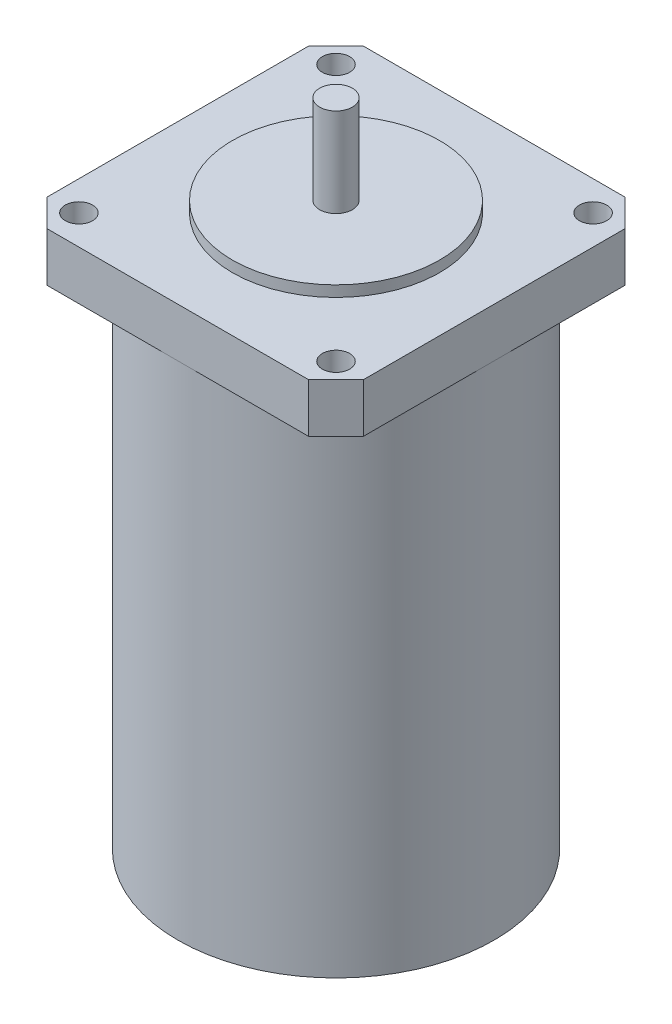
ISO-10303-21;
HEADER;
FILE_DESCRIPTION(('STEP AP214'),'2;1');
FILE_NAME('part.step','',(''),(''),'','','');
FILE_SCHEMA(('AUTOMOTIVE_DESIGN { 1 0 10303 214 1 1 1 1 }'));
ENDSEC;
DATA;
#1=APPLICATION_CONTEXT('core data for automotive mechanical design processes');
#2=APPLICATION_PROTOCOL_DEFINITION('international standard','automotive_design',2000,#1);
#3=PRODUCT_CONTEXT('',#1,'mechanical');
#4=PRODUCT('Part','Part','',(#3));
#5=PRODUCT_RELATED_PRODUCT_CATEGORY('part','',(#4));
#6=PRODUCT_DEFINITION_FORMATION('','',#4);
#7=PRODUCT_DEFINITION_CONTEXT('part definition',#1,'design');
#8=PRODUCT_DEFINITION('design','',#6,#7);
#9=PRODUCT_DEFINITION_SHAPE('','',#8);
#10=(LENGTH_UNIT() NAMED_UNIT(*) SI_UNIT(.MILLI.,.METRE.));
#11=(NAMED_UNIT(*) PLANE_ANGLE_UNIT() SI_UNIT($,.RADIAN.));
#12=(NAMED_UNIT(*) SI_UNIT($,.STERADIAN.) SOLID_ANGLE_UNIT());
#13=UNCERTAINTY_MEASURE_WITH_UNIT(LENGTH_MEASURE(1.E-05),#10,'distance_accuracy_value','');
#14=(GEOMETRIC_REPRESENTATION_CONTEXT(3) GLOBAL_UNCERTAINTY_ASSIGNED_CONTEXT((#13)) GLOBAL_UNIT_ASSIGNED_CONTEXT((#10,
#11,#12)) REPRESENTATION_CONTEXT('',''));
#15=CARTESIAN_POINT('',(0.,0.,0.));
#16=DIRECTION('',(0.,0.,1.));
#17=DIRECTION('',(1.,0.,0.));
#18=AXIS2_PLACEMENT_3D('',#15,#16,#17);
#19=CARTESIAN_POINT('',(0.,101.,0.));
#20=DIRECTION('',(0.,-1.,0.));
#21=DIRECTION('',(0.,0.,-1.));
#22=AXIS2_PLACEMENT_3D('',#19,#20,#21);
#23=CYLINDRICAL_SURFACE('',#22,29.);
#24=CARTESIAN_POINT('',(0.,92.,0.));
#25=DIRECTION('',(0.,-1.,0.));
#26=DIRECTION('',(0.,0.,-1.));
#27=AXIS2_PLACEMENT_3D('',#24,#25,#26);
#28=CIRCLE('',#27,29.);
#29=CARTESIAN_POINT('',(-29.,92.,0.));
#30=VERTEX_POINT('',#29);
#31=CARTESIAN_POINT('',(0.,92.,-29.));
#32=VERTEX_POINT('',#31);
#33=EDGE_CURVE('E48',#30,#32,#28,.T.);
#34=ORIENTED_EDGE('',*,*,#33,.T.);
#35=CARTESIAN_POINT('',(29.,92.,0.));
#36=VERTEX_POINT('',#35);
#37=EDGE_CURVE('E54',#32,#36,#28,.T.);
#38=ORIENTED_EDGE('',*,*,#37,.T.);
#39=CARTESIAN_POINT('',(0.,92.,29.));
#40=VERTEX_POINT('',#39);
#41=EDGE_CURVE('E240',#36,#40,#28,.T.);
#42=ORIENTED_EDGE('',*,*,#41,.T.);
#43=EDGE_CURVE('E236',#40,#30,#28,.T.);
#44=ORIENTED_EDGE('',*,*,#43,.T.);
#45=EDGE_LOOP('',(#34,#38,#42,#44));
#46=FACE_BOUND('',#45,.T.);
#47=CARTESIAN_POINT('',(0.,0.,0.));
#48=DIRECTION('',(0.,1.,0.));
#49=DIRECTION('',(0.,0.,1.));
#50=AXIS2_PLACEMENT_3D('',#47,#48,#49);
#51=CIRCLE('',#50,29.);
#52=CARTESIAN_POINT('',(0.,0.,29.));
#53=VERTEX_POINT('',#52);
#54=EDGE_CURVE('E210',#53,#53,#51,.T.);
#55=ORIENTED_EDGE('',*,*,#54,.T.);
#56=EDGE_LOOP('',(#55));
#57=FACE_BOUND('',#56,.T.);
#58=ADVANCED_FACE('F45',(#46,#57),#23,.T.);
#59=CARTESIAN_POINT('',(0.,0.,0.));
#60=DIRECTION('',(0.,1.,0.));
#61=DIRECTION('',(0.,0.,1.));
#62=AXIS2_PLACEMENT_3D('',#59,#60,#61);
#63=PLANE('',#62);
#64=ORIENTED_EDGE('',*,*,#54,.F.);
#65=EDGE_LOOP('',(#64));
#66=FACE_BOUND('',#65,.T.);
#67=ADVANCED_FACE('F284',(#66),#63,.F.);
#68=CARTESIAN_POINT('',(0.,92.,0.));
#69=DIRECTION('',(0.,-1.,0.));
#70=DIRECTION('',(0.,0.,-1.));
#71=AXIS2_PLACEMENT_3D('',#68,#69,#70);
#72=PLANE('',#71);
#73=ORIENTED_EDGE('',*,*,#37,.F.);
#74=DIRECTION('',(-1.,0.,0.));
#75=VECTOR('',#74,1.);
#76=CARTESIAN_POINT('',(-24.,92.,-29.));
#77=LINE('',#76,#75);
#78=CARTESIAN_POINT('',(24.,92.,-29.));
#79=VERTEX_POINT('',#78);
#80=EDGE_CURVE('E62',#79,#32,#77,.T.);
#81=ORIENTED_EDGE('',*,*,#80,.F.);
#82=DIRECTION('',(-0.707106781186548,0.,-0.707106781186548));
#83=VECTOR('',#82,1.);
#84=CARTESIAN_POINT('',(24.,92.,-29.));
#85=LINE('',#84,#83);
#86=CARTESIAN_POINT('',(29.,92.,-24.));
#87=VERTEX_POINT('',#86);
#88=EDGE_CURVE('E170',#87,#79,#85,.T.);
#89=ORIENTED_EDGE('',*,*,#88,.F.);
#90=DIRECTION('',(0.,0.,-1.));
#91=VECTOR('',#90,1.);
#92=CARTESIAN_POINT('',(29.,92.,24.));
#93=LINE('',#92,#91);
#94=EDGE_CURVE('E165',#36,#87,#93,.T.);
#95=ORIENTED_EDGE('',*,*,#94,.F.);
#96=EDGE_LOOP('',(#73,#81,#89,#95));
#97=FACE_BOUND('',#96,.T.);
#98=CARTESIAN_POINT('',(23.57,92.,-23.57));
#99=DIRECTION('',(0.,1.,0.));
#100=DIRECTION('',(0.,0.,1.));
#101=AXIS2_PLACEMENT_3D('',#98,#99,#100);
#102=CIRCLE('',#101,2.50000000000001);
#103=CARTESIAN_POINT('',(23.57,92.,-21.07));
#104=VERTEX_POINT('',#103);
#105=EDGE_CURVE('E376',#104,#104,#102,.T.);
#106=ORIENTED_EDGE('',*,*,#105,.T.);
#107=EDGE_LOOP('',(#106));
#108=FACE_BOUND('',#107,.T.);
#109=ADVANCED_FACE('F254',(#97,#108),#72,.T.);
#110=ORIENTED_EDGE('',*,*,#41,.F.);
#111=CARTESIAN_POINT('',(29.,92.,24.));
#112=VERTEX_POINT('',#111);
#113=EDGE_CURVE('E166',#112,#36,#93,.T.);
#114=ORIENTED_EDGE('',*,*,#113,.F.);
#115=DIRECTION('',(0.707106781186548,0.,-0.707106781186547));
#116=VECTOR('',#115,1.);
#117=CARTESIAN_POINT('',(24.,92.,29.));
#118=LINE('',#117,#116);
#119=CARTESIAN_POINT('',(24.,92.,29.));
#120=VERTEX_POINT('',#119);
#121=EDGE_CURVE('E161',#120,#112,#118,.T.);
#122=ORIENTED_EDGE('',*,*,#121,.F.);
#123=DIRECTION('',(1.,0.,0.));
#124=VECTOR('',#123,1.);
#125=CARTESIAN_POINT('',(-24.,92.,29.));
#126=LINE('',#125,#124);
#127=EDGE_CURVE('E153',#40,#120,#126,.T.);
#128=ORIENTED_EDGE('',*,*,#127,.F.);
#129=EDGE_LOOP('',(#110,#114,#122,#128));
#130=FACE_BOUND('',#129,.T.);
#131=CARTESIAN_POINT('',(23.57,92.,23.57));
#132=DIRECTION('',(0.,1.,0.));
#133=DIRECTION('',(0.,0.,1.));
#134=AXIS2_PLACEMENT_3D('',#131,#132,#133);
#135=CIRCLE('',#134,2.50000000000001);
#136=CARTESIAN_POINT('',(23.57,92.,26.07));
#137=VERTEX_POINT('',#136);
#138=EDGE_CURVE('E368',#137,#137,#135,.T.);
#139=ORIENTED_EDGE('',*,*,#138,.T.);
#140=EDGE_LOOP('',(#139));
#141=FACE_BOUND('',#140,.T.);
#142=ADVANCED_FACE('F249',(#130,#141),#72,.T.);
#143=ORIENTED_EDGE('',*,*,#43,.F.);
#144=CARTESIAN_POINT('',(-24.,92.,29.));
#145=VERTEX_POINT('',#144);
#146=EDGE_CURVE('E151',#145,#40,#126,.T.);
#147=ORIENTED_EDGE('',*,*,#146,.F.);
#148=DIRECTION('',(0.707106781186547,0.,0.707106781186548));
#149=VECTOR('',#148,1.);
#150=CARTESIAN_POINT('',(-24.,92.,29.));
#151=LINE('',#150,#149);
#152=CARTESIAN_POINT('',(-29.,92.,24.));
#153=VERTEX_POINT('',#152);
#154=EDGE_CURVE('E140',#153,#145,#151,.T.);
#155=ORIENTED_EDGE('',*,*,#154,.F.);
#156=DIRECTION('',(0.,0.,1.));
#157=VECTOR('',#156,1.);
#158=CARTESIAN_POINT('',(-29.,92.,24.));
#159=LINE('',#158,#157);
#160=EDGE_CURVE('E124',#30,#153,#159,.T.);
#161=ORIENTED_EDGE('',*,*,#160,.F.);
#162=EDGE_LOOP('',(#143,#147,#155,#161));
#163=FACE_BOUND('',#162,.T.);
#164=CARTESIAN_POINT('',(-23.57,92.,23.57));
#165=DIRECTION('',(0.,1.,0.));
#166=DIRECTION('',(0.,0.,1.));
#167=AXIS2_PLACEMENT_3D('',#164,#165,#166);
#168=CIRCLE('',#167,2.5);
#169=CARTESIAN_POINT('',(-23.57,92.,26.07));
#170=VERTEX_POINT('',#169);
#171=EDGE_CURVE('E360',#170,#170,#168,.T.);
#172=ORIENTED_EDGE('',*,*,#171,.T.);
#173=EDGE_LOOP('',(#172));
#174=FACE_BOUND('',#173,.T.);
#175=ADVANCED_FACE('F148',(#163,#174),#72,.T.);
#176=CARTESIAN_POINT('',(-29.,92.,24.));
#177=DIRECTION('',(-1.,0.,0.));
#178=DIRECTION('',(0.,0.,1.));
#179=AXIS2_PLACEMENT_3D('',#176,#177,#178);
#180=PLANE('',#179);
#181=CARTESIAN_POINT('',(-29.,92.,-24.));
#182=VERTEX_POINT('',#181);
#183=EDGE_CURVE('E129',#182,#30,#159,.T.);
#184=ORIENTED_EDGE('',*,*,#183,.T.);
#185=ORIENTED_EDGE('',*,*,#160,.T.);
#186=DIRECTION('',(0.,1.,0.));
#187=VECTOR('',#186,1.);
#188=CARTESIAN_POINT('',(-29.,92.,24.));
#189=LINE('',#188,#187);
#190=CARTESIAN_POINT('',(-29.,101.,24.));
#191=VERTEX_POINT('',#190);
#192=EDGE_CURVE('E127',#153,#191,#189,.T.);
#193=ORIENTED_EDGE('',*,*,#192,.T.);
#194=DIRECTION('',(0.,0.,1.));
#195=VECTOR('',#194,1.);
#196=CARTESIAN_POINT('',(-29.,101.,24.));
#197=LINE('',#196,#195);
#198=CARTESIAN_POINT('',(-29.,101.,-24.));
#199=VERTEX_POINT('',#198);
#200=EDGE_CURVE('E180',#199,#191,#197,.T.);
#201=ORIENTED_EDGE('',*,*,#200,.F.);
#202=DIRECTION('',(0.,1.,0.));
#203=VECTOR('',#202,1.);
#204=CARTESIAN_POINT('',(-29.,92.,-24.));
#205=LINE('',#204,#203);
#206=EDGE_CURVE('E206',#182,#199,#205,.T.);
#207=ORIENTED_EDGE('',*,*,#206,.F.);
#208=EDGE_LOOP('',(#184,#185,#193,#201,#207));
#209=FACE_BOUND('',#208,.T.);
#210=ADVANCED_FACE('F126',(#209),#180,.T.);
#211=CARTESIAN_POINT('',(-24.,92.,-29.));
#212=DIRECTION('',(0.,0.,-1.));
#213=DIRECTION('',(-1.,0.,0.));
#214=AXIS2_PLACEMENT_3D('',#211,#212,#213);
#215=PLANE('',#214);
#216=ORIENTED_EDGE('',*,*,#80,.T.);
#217=CARTESIAN_POINT('',(-24.,92.,-29.));
#218=VERTEX_POINT('',#217);
#219=EDGE_CURVE('E174',#32,#218,#77,.T.);
#220=ORIENTED_EDGE('',*,*,#219,.T.);
#221=DIRECTION('',(0.,1.,0.));
#222=VECTOR('',#221,1.);
#223=CARTESIAN_POINT('',(-24.,92.,-29.));
#224=LINE('',#223,#222);
#225=CARTESIAN_POINT('',(-24.,101.,-29.));
#226=VERTEX_POINT('',#225);
#227=EDGE_CURVE('E211',#218,#226,#224,.T.);
#228=ORIENTED_EDGE('',*,*,#227,.T.);
#229=DIRECTION('',(-1.,0.,0.));
#230=VECTOR('',#229,1.);
#231=CARTESIAN_POINT('',(-24.,101.,-29.));
#232=LINE('',#231,#230);
#233=CARTESIAN_POINT('',(24.,101.,-29.));
#234=VERTEX_POINT('',#233);
#235=EDGE_CURVE('E200',#234,#226,#232,.T.);
#236=ORIENTED_EDGE('',*,*,#235,.F.);
#237=DIRECTION('',(0.,1.,0.));
#238=VECTOR('',#237,1.);
#239=CARTESIAN_POINT('',(24.,92.,-29.));
#240=LINE('',#239,#238);
#241=EDGE_CURVE('E215',#79,#234,#240,.T.);
#242=ORIENTED_EDGE('',*,*,#241,.F.);
#243=EDGE_LOOP('',(#216,#220,#228,#236,#242));
#244=FACE_BOUND('',#243,.T.);
#245=ADVANCED_FACE('F279',(#244),#215,.T.);
#246=CARTESIAN_POINT('',(29.,92.,24.));
#247=DIRECTION('',(1.,0.,0.));
#248=DIRECTION('',(0.,0.,-1.));
#249=AXIS2_PLACEMENT_3D('',#246,#247,#248);
#250=PLANE('',#249);
#251=ORIENTED_EDGE('',*,*,#113,.T.);
#252=ORIENTED_EDGE('',*,*,#94,.T.);
#253=DIRECTION('',(0.,1.,0.));
#254=VECTOR('',#253,1.);
#255=CARTESIAN_POINT('',(29.,92.,-24.));
#256=LINE('',#255,#254);
#257=CARTESIAN_POINT('',(29.,101.,-24.));
#258=VERTEX_POINT('',#257);
#259=EDGE_CURVE('E218',#87,#258,#256,.T.);
#260=ORIENTED_EDGE('',*,*,#259,.T.);
#261=DIRECTION('',(0.,0.,-1.));
#262=VECTOR('',#261,1.);
#263=CARTESIAN_POINT('',(29.,101.,24.));
#264=LINE('',#263,#262);
#265=CARTESIAN_POINT('',(29.,101.,24.));
#266=VERTEX_POINT('',#265);
#267=EDGE_CURVE('E193',#266,#258,#264,.T.);
#268=ORIENTED_EDGE('',*,*,#267,.F.);
#269=DIRECTION('',(0.,1.,0.));
#270=VECTOR('',#269,1.);
#271=CARTESIAN_POINT('',(29.,92.,24.));
#272=LINE('',#271,#270);
#273=EDGE_CURVE('E222',#112,#266,#272,.T.);
#274=ORIENTED_EDGE('',*,*,#273,.F.);
#275=EDGE_LOOP('',(#251,#252,#260,#268,#274));
#276=FACE_BOUND('',#275,.T.);
#277=ADVANCED_FACE('F259',(#276),#250,.T.);
#278=CARTESIAN_POINT('',(-24.,92.,29.));
#279=DIRECTION('',(0.,0.,1.));
#280=DIRECTION('',(1.,0.,0.));
#281=AXIS2_PLACEMENT_3D('',#278,#279,#280);
#282=PLANE('',#281);
#283=ORIENTED_EDGE('',*,*,#146,.T.);
#284=ORIENTED_EDGE('',*,*,#127,.T.);
#285=DIRECTION('',(0.,1.,0.));
#286=VECTOR('',#285,1.);
#287=CARTESIAN_POINT('',(24.,92.,29.));
#288=LINE('',#287,#286);
#289=CARTESIAN_POINT('',(24.,101.,29.));
#290=VERTEX_POINT('',#289);
#291=EDGE_CURVE('E226',#120,#290,#288,.T.);
#292=ORIENTED_EDGE('',*,*,#291,.T.);
#293=DIRECTION('',(1.,0.,0.));
#294=VECTOR('',#293,1.);
#295=CARTESIAN_POINT('',(-24.,101.,29.));
#296=LINE('',#295,#294);
#297=CARTESIAN_POINT('',(-24.,101.,29.));
#298=VERTEX_POINT('',#297);
#299=EDGE_CURVE('E186',#298,#290,#296,.T.);
#300=ORIENTED_EDGE('',*,*,#299,.F.);
#301=DIRECTION('',(0.,1.,0.));
#302=VECTOR('',#301,1.);
#303=CARTESIAN_POINT('',(-24.,92.,29.));
#304=LINE('',#303,#302);
#305=EDGE_CURVE('E144',#145,#298,#304,.T.);
#306=ORIENTED_EDGE('',*,*,#305,.F.);
#307=EDGE_LOOP('',(#283,#284,#292,#300,#306));
#308=FACE_BOUND('',#307,.T.);
#309=ADVANCED_FACE('F268',(#308),#282,.T.);
#310=CARTESIAN_POINT('',(-29.,92.,-24.));
#311=DIRECTION('',(-0.707106781186547,0.,-0.707106781186547));
#312=DIRECTION('',(-0.707106781186548,0.,0.707106781186548));
#313=AXIS2_PLACEMENT_3D('',#310,#311,#312);
#314=PLANE('',#313);
#315=DIRECTION('',(-0.707106781186547,0.,0.707106781186547));
#316=VECTOR('',#315,1.);
#317=CARTESIAN_POINT('',(-29.,101.,-24.));
#318=LINE('',#317,#316);
#319=EDGE_CURVE('E134',#226,#199,#318,.T.);
#320=ORIENTED_EDGE('',*,*,#319,.F.);
#321=ORIENTED_EDGE('',*,*,#227,.F.);
#322=DIRECTION('',(-0.707106781186547,0.,0.707106781186547));
#323=VECTOR('',#322,1.);
#324=CARTESIAN_POINT('',(-29.,92.,-24.));
#325=LINE('',#324,#323);
#326=EDGE_CURVE('E145',#218,#182,#325,.T.);
#327=ORIENTED_EDGE('',*,*,#326,.T.);
#328=ORIENTED_EDGE('',*,*,#206,.T.);
#329=EDGE_LOOP('',(#320,#321,#327,#328));
#330=FACE_BOUND('',#329,.T.);
#331=ADVANCED_FACE('F270',(#330),#314,.T.);
#332=CARTESIAN_POINT('',(24.,92.,-29.));
#333=DIRECTION('',(0.707106781186547,0.,-0.707106781186547));
#334=DIRECTION('',(-0.707106781186548,0.,-0.707106781186548));
#335=AXIS2_PLACEMENT_3D('',#332,#333,#334);
#336=PLANE('',#335);
#337=DIRECTION('',(-0.707106781186548,0.,-0.707106781186548));
#338=VECTOR('',#337,1.);
#339=CARTESIAN_POINT('',(24.,101.,-29.));
#340=LINE('',#339,#338);
#341=EDGE_CURVE('E196',#258,#234,#340,.T.);
#342=ORIENTED_EDGE('',*,*,#341,.F.);
#343=ORIENTED_EDGE('',*,*,#259,.F.);
#344=ORIENTED_EDGE('',*,*,#88,.T.);
#345=ORIENTED_EDGE('',*,*,#241,.T.);
#346=EDGE_LOOP('',(#342,#343,#344,#345));
#347=FACE_BOUND('',#346,.T.);
#348=ADVANCED_FACE('F276',(#347),#336,.T.);
#349=CARTESIAN_POINT('',(24.,92.,29.));
#350=DIRECTION('',(0.707106781186547,0.,0.707106781186548));
#351=DIRECTION('',(0.707106781186548,0.,-0.707106781186547));
#352=AXIS2_PLACEMENT_3D('',#349,#350,#351);
#353=PLANE('',#352);
#354=DIRECTION('',(0.707106781186548,0.,-0.707106781186547));
#355=VECTOR('',#354,1.);
#356=CARTESIAN_POINT('',(24.,101.,29.));
#357=LINE('',#356,#355);
#358=EDGE_CURVE('E189',#290,#266,#357,.T.);
#359=ORIENTED_EDGE('',*,*,#358,.F.);
#360=ORIENTED_EDGE('',*,*,#291,.F.);
#361=ORIENTED_EDGE('',*,*,#121,.T.);
#362=ORIENTED_EDGE('',*,*,#273,.T.);
#363=EDGE_LOOP('',(#359,#360,#361,#362));
#364=FACE_BOUND('',#363,.T.);
#365=ADVANCED_FACE('F262',(#364),#353,.T.);
#366=CARTESIAN_POINT('',(-24.,92.,29.));
#367=DIRECTION('',(-0.707106781186548,0.,0.707106781186547));
#368=DIRECTION('',(0.707106781186547,0.,0.707106781186548));
#369=AXIS2_PLACEMENT_3D('',#366,#367,#368);
#370=PLANE('',#369);
#371=DIRECTION('',(0.707106781186547,0.,0.707106781186548));
#372=VECTOR('',#371,1.);
#373=CARTESIAN_POINT('',(-24.,101.,29.));
#374=LINE('',#373,#372);
#375=EDGE_CURVE('E142',#191,#298,#374,.T.);
#376=ORIENTED_EDGE('',*,*,#375,.F.);
#377=ORIENTED_EDGE('',*,*,#192,.F.);
#378=ORIENTED_EDGE('',*,*,#154,.T.);
#379=ORIENTED_EDGE('',*,*,#305,.T.);
#380=EDGE_LOOP('',(#376,#377,#378,#379));
#381=FACE_BOUND('',#380,.T.);
#382=ADVANCED_FACE('F138',(#381),#370,.T.);
#383=ORIENTED_EDGE('',*,*,#33,.F.);
#384=ORIENTED_EDGE('',*,*,#183,.F.);
#385=ORIENTED_EDGE('',*,*,#326,.F.);
#386=ORIENTED_EDGE('',*,*,#219,.F.);
#387=EDGE_LOOP('',(#383,#384,#385,#386));
#388=FACE_BOUND('',#387,.T.);
#389=CARTESIAN_POINT('',(-23.57,92.,-23.57));
#390=DIRECTION('',(0.,1.,0.));
#391=DIRECTION('',(0.,0.,1.));
#392=AXIS2_PLACEMENT_3D('',#389,#390,#391);
#393=CIRCLE('',#392,2.5);
#394=CARTESIAN_POINT('',(-23.57,92.,-21.07));
#395=VERTEX_POINT('',#394);
#396=EDGE_CURVE('E183',#395,#395,#393,.T.);
#397=ORIENTED_EDGE('',*,*,#396,.T.);
#398=EDGE_LOOP('',(#397));
#399=FACE_BOUND('',#398,.T.);
#400=ADVANCED_FACE('F293',(#388,#399),#72,.T.);
#401=CARTESIAN_POINT('',(-23.57,92.,-23.57));
#402=DIRECTION('',(0.,1.,0.));
#403=DIRECTION('',(0.,0.,1.));
#404=AXIS2_PLACEMENT_3D('',#401,#402,#403);
#405=CYLINDRICAL_SURFACE('',#404,2.5);
#406=ORIENTED_EDGE('',*,*,#396,.F.);
#407=EDGE_LOOP('',(#406));
#408=FACE_BOUND('',#407,.T.);
#409=CARTESIAN_POINT('',(-23.57,101.,-23.57));
#410=DIRECTION('',(0.,1.,0.));
#411=DIRECTION('',(0.,0.,1.));
#412=AXIS2_PLACEMENT_3D('',#409,#410,#411);
#413=CIRCLE('',#412,2.5);
#414=CARTESIAN_POINT('',(-23.57,101.,-21.07));
#415=VERTEX_POINT('',#414);
#416=EDGE_CURVE('E380',#415,#415,#413,.T.);
#417=ORIENTED_EDGE('',*,*,#416,.T.);
#418=EDGE_LOOP('',(#417));
#419=FACE_BOUND('',#418,.T.);
#420=ADVANCED_FACE('F306',(#408,#419),#405,.F.);
#421=CARTESIAN_POINT('',(23.57,92.,-23.57));
#422=DIRECTION('',(0.,1.,0.));
#423=DIRECTION('',(0.,0.,1.));
#424=AXIS2_PLACEMENT_3D('',#421,#422,#423);
#425=CYLINDRICAL_SURFACE('',#424,2.50000000000001);
#426=ORIENTED_EDGE('',*,*,#105,.F.);
#427=EDGE_LOOP('',(#426));
#428=FACE_BOUND('',#427,.T.);
#429=CARTESIAN_POINT('',(23.57,101.,-23.57));
#430=DIRECTION('',(0.,1.,0.));
#431=DIRECTION('',(0.,0.,1.));
#432=AXIS2_PLACEMENT_3D('',#429,#430,#431);
#433=CIRCLE('',#432,2.50000000000001);
#434=CARTESIAN_POINT('',(23.57,101.,-21.07));
#435=VERTEX_POINT('',#434);
#436=EDGE_CURVE('E372',#435,#435,#433,.T.);
#437=ORIENTED_EDGE('',*,*,#436,.T.);
#438=EDGE_LOOP('',(#437));
#439=FACE_BOUND('',#438,.T.);
#440=ADVANCED_FACE('F317',(#428,#439),#425,.F.);
#441=CARTESIAN_POINT('',(23.57,92.,23.57));
#442=DIRECTION('',(0.,1.,0.));
#443=DIRECTION('',(0.,0.,1.));
#444=AXIS2_PLACEMENT_3D('',#441,#442,#443);
#445=CYLINDRICAL_SURFACE('',#444,2.50000000000001);
#446=ORIENTED_EDGE('',*,*,#138,.F.);
#447=EDGE_LOOP('',(#446));
#448=FACE_BOUND('',#447,.T.);
#449=CARTESIAN_POINT('',(23.57,101.,23.57));
#450=DIRECTION('',(0.,1.,0.));
#451=DIRECTION('',(0.,0.,1.));
#452=AXIS2_PLACEMENT_3D('',#449,#450,#451);
#453=CIRCLE('',#452,2.50000000000001);
#454=CARTESIAN_POINT('',(23.57,101.,26.07));
#455=VERTEX_POINT('',#454);
#456=EDGE_CURVE('E364',#455,#455,#453,.T.);
#457=ORIENTED_EDGE('',*,*,#456,.T.);
#458=EDGE_LOOP('',(#457));
#459=FACE_BOUND('',#458,.T.);
#460=ADVANCED_FACE('F321',(#448,#459),#445,.F.);
#461=CARTESIAN_POINT('',(-23.57,92.,23.57));
#462=DIRECTION('',(0.,1.,0.));
#463=DIRECTION('',(0.,0.,1.));
#464=AXIS2_PLACEMENT_3D('',#461,#462,#463);
#465=CYLINDRICAL_SURFACE('',#464,2.5);
#466=ORIENTED_EDGE('',*,*,#171,.F.);
#467=EDGE_LOOP('',(#466));
#468=FACE_BOUND('',#467,.T.);
#469=CARTESIAN_POINT('',(-23.57,101.,23.57));
#470=DIRECTION('',(0.,1.,0.));
#471=DIRECTION('',(0.,0.,1.));
#472=AXIS2_PLACEMENT_3D('',#469,#470,#471);
#473=CIRCLE('',#472,2.5);
#474=CARTESIAN_POINT('',(-23.57,101.,26.07));
#475=VERTEX_POINT('',#474);
#476=EDGE_CURVE('E358',#475,#475,#473,.T.);
#477=ORIENTED_EDGE('',*,*,#476,.T.);
#478=EDGE_LOOP('',(#477));
#479=FACE_BOUND('',#478,.T.);
#480=ADVANCED_FACE('F298',(#468,#479),#465,.F.);
#481=CARTESIAN_POINT('',(0.,101.,0.));
#482=DIRECTION('',(0.,1.,0.));
#483=DIRECTION('',(0.,0.,1.));
#484=AXIS2_PLACEMENT_3D('',#481,#482,#483);
#485=PLANE('',#484);
#486=CARTESIAN_POINT('',(0.,101.,0.));
#487=DIRECTION('',(0.,1.,0.));
#488=DIRECTION('',(0.,0.,1.));
#489=AXIS2_PLACEMENT_3D('',#486,#487,#488);
#490=CIRCLE('',#489,19.);
#491=CARTESIAN_POINT('',(0.,101.,19.));
#492=VERTEX_POINT('',#491);
#493=EDGE_CURVE('E349',#492,#492,#490,.T.);
#494=ORIENTED_EDGE('',*,*,#493,.F.);
#495=EDGE_LOOP('',(#494));
#496=FACE_BOUND('',#495,.T.);
#497=ORIENTED_EDGE('',*,*,#375,.T.);
#498=ORIENTED_EDGE('',*,*,#299,.T.);
#499=ORIENTED_EDGE('',*,*,#358,.T.);
#500=ORIENTED_EDGE('',*,*,#267,.T.);
#501=ORIENTED_EDGE('',*,*,#341,.T.);
#502=ORIENTED_EDGE('',*,*,#235,.T.);
#503=ORIENTED_EDGE('',*,*,#319,.T.);
#504=ORIENTED_EDGE('',*,*,#200,.T.);
#505=EDGE_LOOP('',(#497,#498,#499,#500,#501,#502,#503,#504));
#506=FACE_BOUND('',#505,.T.);
#507=ORIENTED_EDGE('',*,*,#416,.F.);
#508=EDGE_LOOP('',(#507));
#509=FACE_BOUND('',#508,.T.);
#510=ORIENTED_EDGE('',*,*,#476,.F.);
#511=EDGE_LOOP('',(#510));
#512=FACE_BOUND('',#511,.T.);
#513=ORIENTED_EDGE('',*,*,#456,.F.);
#514=EDGE_LOOP('',(#513));
#515=FACE_BOUND('',#514,.T.);
#516=ORIENTED_EDGE('',*,*,#436,.F.);
#517=EDGE_LOOP('',(#516));
#518=FACE_BOUND('',#517,.T.);
#519=ADVANCED_FACE('F265',(#496,#506,#509,#512,#515,#518),#485,.T.);
#520=CARTESIAN_POINT('',(0.,103.,0.));
#521=DIRECTION('',(0.,-1.,0.));
#522=DIRECTION('',(0.,0.,-1.));
#523=AXIS2_PLACEMENT_3D('',#520,#521,#522);
#524=CYLINDRICAL_SURFACE('',#523,19.);
#525=CARTESIAN_POINT('',(0.,103.,0.));
#526=DIRECTION('',(0.,1.,0.));
#527=DIRECTION('',(0.,0.,1.));
#528=AXIS2_PLACEMENT_3D('',#525,#526,#527);
#529=CIRCLE('',#528,19.);
#530=CARTESIAN_POINT('',(0.,103.,19.));
#531=VERTEX_POINT('',#530);
#532=EDGE_CURVE('E353',#531,#531,#529,.T.);
#533=ORIENTED_EDGE('',*,*,#532,.F.);
#534=EDGE_LOOP('',(#533));
#535=FACE_BOUND('',#534,.T.);
#536=ORIENTED_EDGE('',*,*,#493,.T.);
#537=EDGE_LOOP('',(#536));
#538=FACE_BOUND('',#537,.T.);
#539=ADVANCED_FACE('F297',(#535,#538),#524,.T.);
#540=CARTESIAN_POINT('',(0.,103.,0.));
#541=DIRECTION('',(0.,1.,0.));
#542=DIRECTION('',(0.,0.,1.));
#543=AXIS2_PLACEMENT_3D('',#540,#541,#542);
#544=PLANE('',#543);
#545=CARTESIAN_POINT('',(0.,103.,0.));
#546=DIRECTION('',(0.,1.,0.));
#547=DIRECTION('',(0.,0.,1.));
#548=AXIS2_PLACEMENT_3D('',#545,#546,#547);
#549=CIRCLE('',#548,3.);
#550=CARTESIAN_POINT('',(0.,103.,3.));
#551=VERTEX_POINT('',#550);
#552=EDGE_CURVE('E11',#551,#551,#549,.T.);
#553=ORIENTED_EDGE('',*,*,#552,.F.);
#554=EDGE_LOOP('',(#553));
#555=FACE_BOUND('',#554,.T.);
#556=ORIENTED_EDGE('',*,*,#532,.T.);
#557=EDGE_LOOP('',(#556));
#558=FACE_BOUND('',#557,.T.);
#559=ADVANCED_FACE('F331',(#555,#558),#544,.T.);
#560=CARTESIAN_POINT('',(0.,119.3,0.));
#561=DIRECTION('',(0.,-1.,0.));
#562=DIRECTION('',(0.,0.,-1.));
#563=AXIS2_PLACEMENT_3D('',#560,#561,#562);
#564=CYLINDRICAL_SURFACE('',#563,3.);
#565=CARTESIAN_POINT('',(0.,119.3,0.));
#566=DIRECTION('',(0.,1.,0.));
#567=DIRECTION('',(0.,0.,1.));
#568=AXIS2_PLACEMENT_3D('',#565,#566,#567);
#569=CIRCLE('',#568,3.);
#570=CARTESIAN_POINT('',(0.,119.3,3.));
#571=VERTEX_POINT('',#570);
#572=EDGE_CURVE('E347',#571,#571,#569,.T.);
#573=ORIENTED_EDGE('',*,*,#572,.F.);
#574=EDGE_LOOP('',(#573));
#575=FACE_BOUND('',#574,.T.);
#576=ORIENTED_EDGE('',*,*,#552,.T.);
#577=EDGE_LOOP('',(#576));
#578=FACE_BOUND('',#577,.T.);
#579=ADVANCED_FACE('F335',(#575,#578),#564,.T.);
#580=CARTESIAN_POINT('',(0.,119.3,0.));
#581=DIRECTION('',(0.,1.,0.));
#582=DIRECTION('',(0.,0.,1.));
#583=AXIS2_PLACEMENT_3D('',#580,#581,#582);
#584=PLANE('',#583);
#585=ORIENTED_EDGE('',*,*,#572,.T.);
#586=EDGE_LOOP('',(#585));
#587=FACE_BOUND('',#586,.T.);
#588=ADVANCED_FACE('F339',(#587),#584,.T.);
#589=CLOSED_SHELL('',(#58,#67,#109,#142,#175,#210,#245,#277,#309,#331,#348,#365,#382,#400,#420,
#440,#460,#480,#519,#539,#559,#579,#588));
#590=MANIFOLD_SOLID_BREP('B2',#589);
#591=ADVANCED_BREP_SHAPE_REPRESENTATION('',(#18,#590),#14);
#592=SHAPE_DEFINITION_REPRESENTATION(#9,#591);
ENDSEC;
END-ISO-10303-21;
